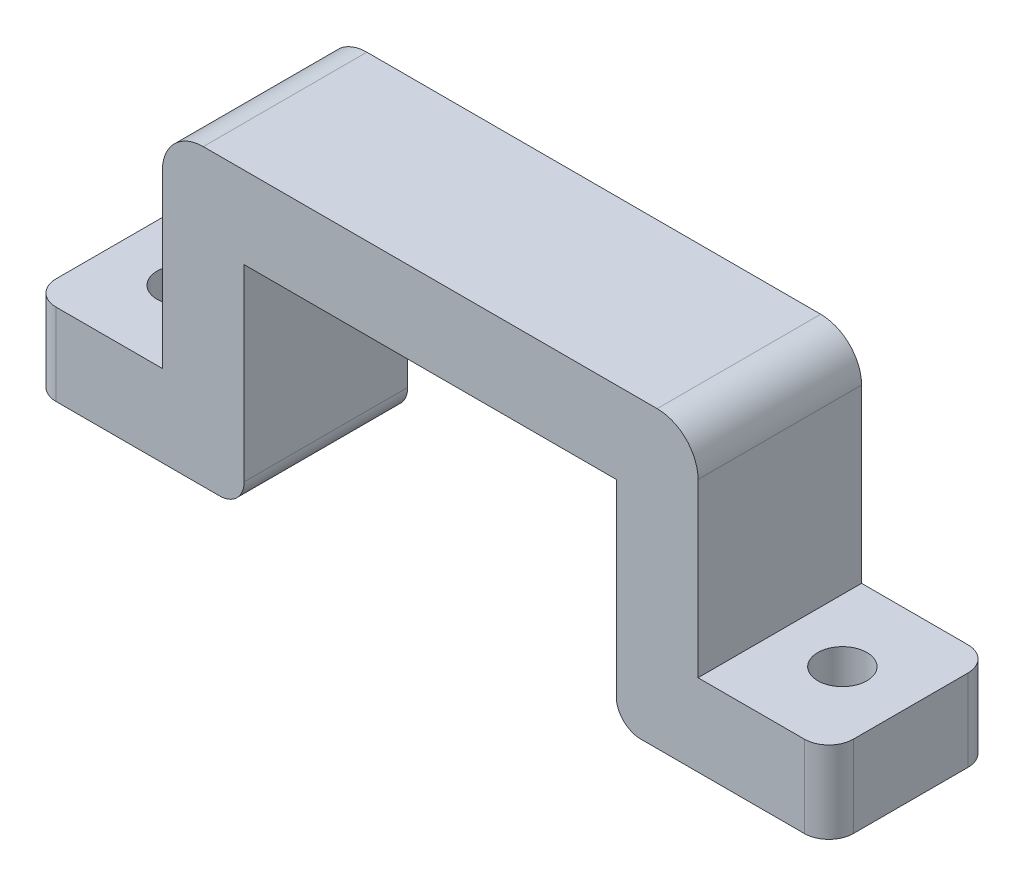
ISO-10303-21;
HEADER;
FILE_DESCRIPTION(('STEP AP214'),'2;1');
FILE_NAME('part.step','',(''),(''),'','','');
FILE_SCHEMA(('AUTOMOTIVE_DESIGN { 1 0 10303 214 1 1 1 1 }'));
ENDSEC;
DATA;
#1=APPLICATION_CONTEXT('core data for automotive mechanical design processes');
#2=APPLICATION_PROTOCOL_DEFINITION('international standard','automotive_design',2000,#1);
#3=PRODUCT_CONTEXT('',#1,'mechanical');
#4=PRODUCT('Part','Part','',(#3));
#5=PRODUCT_RELATED_PRODUCT_CATEGORY('part','',(#4));
#6=PRODUCT_DEFINITION_FORMATION('','',#4);
#7=PRODUCT_DEFINITION_CONTEXT('part definition',#1,'design');
#8=PRODUCT_DEFINITION('design','',#6,#7);
#9=PRODUCT_DEFINITION_SHAPE('','',#8);
#10=(LENGTH_UNIT() NAMED_UNIT(*) SI_UNIT(.MILLI.,.METRE.));
#11=(NAMED_UNIT(*) PLANE_ANGLE_UNIT() SI_UNIT($,.RADIAN.));
#12=(NAMED_UNIT(*) SI_UNIT($,.STERADIAN.) SOLID_ANGLE_UNIT());
#13=UNCERTAINTY_MEASURE_WITH_UNIT(LENGTH_MEASURE(1.E-05),#10,'distance_accuracy_value','');
#14=(GEOMETRIC_REPRESENTATION_CONTEXT(3) GLOBAL_UNCERTAINTY_ASSIGNED_CONTEXT((#13)) GLOBAL_UNIT_ASSIGNED_CONTEXT((#10,
#11,#12)) REPRESENTATION_CONTEXT('',''));
#15=CARTESIAN_POINT('',(0.,0.,0.));
#16=DIRECTION('',(0.,0.,1.));
#17=DIRECTION('',(1.,0.,0.));
#18=AXIS2_PLACEMENT_3D('',#15,#16,#17);
#19=CARTESIAN_POINT('',(16.375,0.,10.));
#20=DIRECTION('',(1.,0.,0.));
#21=DIRECTION('',(0.,0.,-1.));
#22=AXIS2_PLACEMENT_3D('',#19,#20,#21);
#23=PLANE('',#22);
#24=DIRECTION('',(0.,-1.,0.));
#25=VECTOR('',#24,1.);
#26=CARTESIAN_POINT('',(16.375,0.,10.));
#27=LINE('',#26,#25);
#28=CARTESIAN_POINT('',(16.375,9.,10.));
#29=VERTEX_POINT('',#28);
#30=CARTESIAN_POINT('',(16.375,-1.49999999999999,10.));
#31=VERTEX_POINT('',#30);
#32=EDGE_CURVE('E178',#29,#31,#27,.T.);
#33=ORIENTED_EDGE('',*,*,#32,.T.);
#34=DIRECTION('',(0.,0.,1.));
#35=VECTOR('',#34,1.);
#36=CARTESIAN_POINT('',(16.375,-1.49999999999999,0.));
#37=LINE('',#36,#35);
#38=CARTESIAN_POINT('',(16.375,-1.49999999999999,0.));
#39=VERTEX_POINT('',#38);
#40=EDGE_CURVE('E187',#39,#31,#37,.T.);
#41=ORIENTED_EDGE('',*,*,#40,.F.);
#42=DIRECTION('',(0.,-1.,0.));
#43=VECTOR('',#42,1.);
#44=CARTESIAN_POINT('',(16.375,0.,0.));
#45=LINE('',#44,#43);
#46=CARTESIAN_POINT('',(16.375,9.,0.));
#47=VERTEX_POINT('',#46);
#48=EDGE_CURVE('E230',#47,#39,#45,.T.);
#49=ORIENTED_EDGE('',*,*,#48,.F.);
#50=DIRECTION('',(0.,0.,-1.));
#51=VECTOR('',#50,1.);
#52=CARTESIAN_POINT('',(16.375,9.,10.));
#53=LINE('',#52,#51);
#54=EDGE_CURVE('E197',#29,#47,#53,.T.);
#55=ORIENTED_EDGE('',*,*,#54,.F.);
#56=EDGE_LOOP('',(#33,#41,#49,#55));
#57=FACE_BOUND('',#56,.T.);
#58=ADVANCED_FACE('F37',(#57),#23,.T.);
#59=CARTESIAN_POINT('',(-16.375,0.,10.));
#60=DIRECTION('',(1.,0.,0.));
#61=DIRECTION('',(0.,1.,0.));
#62=AXIS2_PLACEMENT_3D('',#59,#60,#61);
#63=PLANE('',#62);
#64=DIRECTION('',(0.,0.,-1.));
#65=VECTOR('',#64,1.);
#66=CARTESIAN_POINT('',(-16.375,-1.5,0.));
#67=LINE('',#66,#65);
#68=CARTESIAN_POINT('',(-16.375,-1.5,10.));
#69=VERTEX_POINT('',#68);
#70=CARTESIAN_POINT('',(-16.375,-1.5,0.));
#71=VERTEX_POINT('',#70);
#72=EDGE_CURVE('E183',#69,#71,#67,.T.);
#73=ORIENTED_EDGE('',*,*,#72,.F.);
#74=DIRECTION('',(0.,-1.,0.));
#75=VECTOR('',#74,1.);
#76=CARTESIAN_POINT('',(-16.375,0.,10.));
#77=LINE('',#76,#75);
#78=CARTESIAN_POINT('',(-16.375,9.,10.));
#79=VERTEX_POINT('',#78);
#80=EDGE_CURVE('E327',#79,#69,#77,.T.);
#81=ORIENTED_EDGE('',*,*,#80,.F.);
#82=DIRECTION('',(0.,0.,-1.));
#83=VECTOR('',#82,1.);
#84=CARTESIAN_POINT('',(-16.375,9.,10.));
#85=LINE('',#84,#83);
#86=CARTESIAN_POINT('',(-16.375,9.,0.));
#87=VERTEX_POINT('',#86);
#88=EDGE_CURVE('E248',#79,#87,#85,.T.);
#89=ORIENTED_EDGE('',*,*,#88,.T.);
#90=DIRECTION('',(0.,-1.,0.));
#91=VECTOR('',#90,1.);
#92=CARTESIAN_POINT('',(-16.375,0.,0.));
#93=LINE('',#92,#91);
#94=EDGE_CURVE('E214',#87,#71,#93,.T.);
#95=ORIENTED_EDGE('',*,*,#94,.T.);
#96=EDGE_LOOP('',(#73,#81,#89,#95));
#97=FACE_BOUND('',#96,.T.);
#98=ADVANCED_FACE('F396',(#97),#63,.F.);
#99=CARTESIAN_POINT('',(-13.875,9.,10.));
#100=DIRECTION('',(0.,0.,-1.));
#101=DIRECTION('',(-1.,0.,0.));
#102=AXIS2_PLACEMENT_3D('',#99,#100,#101);
#103=CYLINDRICAL_SURFACE('',#102,2.5);
#104=CARTESIAN_POINT('',(-13.875,9.,0.));
#105=DIRECTION('',(0.,0.,1.));
#106=DIRECTION('',(1.,0.,0.));
#107=AXIS2_PLACEMENT_3D('',#104,#105,#106);
#108=CIRCLE('',#107,2.5);
#109=CARTESIAN_POINT('',(-13.875,11.5,0.));
#110=VERTEX_POINT('',#109);
#111=EDGE_CURVE('E211',#87,#110,#108,.F.);
#112=ORIENTED_EDGE('',*,*,#111,.F.);
#113=ORIENTED_EDGE('',*,*,#88,.F.);
#114=CARTESIAN_POINT('',(-13.875,9.,10.));
#115=DIRECTION('',(0.,0.,1.));
#116=DIRECTION('',(1.,0.,0.));
#117=AXIS2_PLACEMENT_3D('',#114,#115,#116);
#118=CIRCLE('',#117,2.5);
#119=CARTESIAN_POINT('',(-13.875,11.5,10.));
#120=VERTEX_POINT('',#119);
#121=EDGE_CURVE('E238',#79,#120,#118,.F.);
#122=ORIENTED_EDGE('',*,*,#121,.T.);
#123=DIRECTION('',(0.,0.,-1.));
#124=VECTOR('',#123,1.);
#125=CARTESIAN_POINT('',(-13.875,11.5,10.));
#126=LINE('',#125,#124);
#127=EDGE_CURVE('E210',#120,#110,#126,.T.);
#128=ORIENTED_EDGE('',*,*,#127,.T.);
#129=EDGE_LOOP('',(#112,#113,#122,#128));
#130=FACE_BOUND('',#129,.T.);
#131=ADVANCED_FACE('F400',(#130),#103,.T.);
#132=CARTESIAN_POINT('',(0.,-6.5,10.));
#133=DIRECTION('',(0.,-1.,0.));
#134=DIRECTION('',(1.,0.,0.));
#135=AXIS2_PLACEMENT_3D('',#132,#133,#134);
#136=PLANE('',#135);
#137=CARTESIAN_POINT('',(-20.1985294117647,-6.50000000000001,5.));
#138=DIRECTION('',(0.,1.,0.));
#139=DIRECTION('',(-1.,0.,0.));
#140=AXIS2_PLACEMENT_3D('',#137,#138,#139);
#141=CIRCLE('',#140,1.5);
#142=CARTESIAN_POINT('',(-21.6985294117647,-6.50000000000001,5.));
#143=VERTEX_POINT('',#142);
#144=EDGE_CURVE('E195',#143,#143,#141,.T.);
#145=ORIENTED_EDGE('',*,*,#144,.T.);
#146=EDGE_LOOP('',(#145));
#147=FACE_BOUND('',#146,.T.);
#148=DIRECTION('',(-1.,0.,0.));
#149=VECTOR('',#148,1.);
#150=CARTESIAN_POINT('',(0.,-6.5,0.));
#151=LINE('',#150,#149);
#152=CARTESIAN_POINT('',(-12.875,-6.5,0.));
#153=VERTEX_POINT('',#152);
#154=CARTESIAN_POINT('',(-22.875,-6.5,0.));
#155=VERTEX_POINT('',#154);
#156=EDGE_CURVE('E218',#153,#155,#151,.T.);
#157=ORIENTED_EDGE('',*,*,#156,.F.);
#158=DIRECTION('',(0.,0.,-1.));
#159=VECTOR('',#158,1.);
#160=CARTESIAN_POINT('',(-12.875,-6.5,10.));
#161=LINE('',#160,#159);
#162=CARTESIAN_POINT('',(-12.875,-6.5,10.));
#163=VERTEX_POINT('',#162);
#164=EDGE_CURVE('E11',#153,#163,#161,.F.);
#165=ORIENTED_EDGE('',*,*,#164,.T.);
#166=DIRECTION('',(-1.,0.,0.));
#167=VECTOR('',#166,1.);
#168=CARTESIAN_POINT('',(0.,-6.5,10.));
#169=LINE('',#168,#167);
#170=CARTESIAN_POINT('',(-22.875,-6.5,10.));
#171=VERTEX_POINT('',#170);
#172=EDGE_CURVE('E325',#163,#171,#169,.T.);
#173=ORIENTED_EDGE('',*,*,#172,.T.);
#174=CARTESIAN_POINT('',(-22.875,-6.5,8.5));
#175=DIRECTION('',(0.,-1.,0.));
#176=DIRECTION('',(1.,0.,0.));
#177=AXIS2_PLACEMENT_3D('',#174,#175,#176);
#178=CIRCLE('',#177,1.5);
#179=CARTESIAN_POINT('',(-24.375,-6.5,8.5));
#180=VERTEX_POINT('',#179);
#181=EDGE_CURVE('E280',#171,#180,#178,.T.);
#182=ORIENTED_EDGE('',*,*,#181,.T.);
#183=DIRECTION('',(0.,0.,1.));
#184=VECTOR('',#183,1.);
#185=CARTESIAN_POINT('',(-24.375,-6.5,0.));
#186=LINE('',#185,#184);
#187=CARTESIAN_POINT('',(-24.375,-6.5,1.5));
#188=VERTEX_POINT('',#187);
#189=EDGE_CURVE('E338',#188,#180,#186,.T.);
#190=ORIENTED_EDGE('',*,*,#189,.F.);
#191=CARTESIAN_POINT('',(-22.875,-6.5,1.5));
#192=DIRECTION('',(0.,-1.,0.));
#193=DIRECTION('',(1.,0.,0.));
#194=AXIS2_PLACEMENT_3D('',#191,#192,#193);
#195=CIRCLE('',#194,1.5);
#196=EDGE_CURVE('E282',#188,#155,#195,.T.);
#197=ORIENTED_EDGE('',*,*,#196,.T.);
#198=EDGE_LOOP('',(#157,#165,#173,#182,#190,#197));
#199=FACE_BOUND('',#198,.T.);
#200=ADVANCED_FACE('F361',(#147,#199),#136,.T.);
#201=CARTESIAN_POINT('',(-11.375,0.,10.));
#202=DIRECTION('',(1.,0.,0.));
#203=DIRECTION('',(0.,1.,0.));
#204=AXIS2_PLACEMENT_3D('',#201,#202,#203);
#205=PLANE('',#204);
#206=DIRECTION('',(0.,-1.,0.));
#207=VECTOR('',#206,1.);
#208=CARTESIAN_POINT('',(-11.375,0.,10.));
#209=LINE('',#208,#207);
#210=CARTESIAN_POINT('',(-11.375,6.5,10.));
#211=VERTEX_POINT('',#210);
#212=CARTESIAN_POINT('',(-11.375,-5.,10.));
#213=VERTEX_POINT('',#212);
#214=EDGE_CURVE('E305',#211,#213,#209,.T.);
#215=ORIENTED_EDGE('',*,*,#214,.T.);
#216=DIRECTION('',(0.,0.,-1.));
#217=VECTOR('',#216,1.);
#218=CARTESIAN_POINT('',(-11.375,-5.,10.));
#219=LINE('',#218,#217);
#220=CARTESIAN_POINT('',(-11.375,-5.,0.));
#221=VERTEX_POINT('',#220);
#222=EDGE_CURVE('E45',#213,#221,#219,.T.);
#223=ORIENTED_EDGE('',*,*,#222,.T.);
#224=DIRECTION('',(0.,-1.,0.));
#225=VECTOR('',#224,1.);
#226=CARTESIAN_POINT('',(-11.375,0.,0.));
#227=LINE('',#226,#225);
#228=CARTESIAN_POINT('',(-11.375,6.5,0.));
#229=VERTEX_POINT('',#228);
#230=EDGE_CURVE('E220',#229,#221,#227,.T.);
#231=ORIENTED_EDGE('',*,*,#230,.F.);
#232=DIRECTION('',(0.,0.,-1.));
#233=VECTOR('',#232,1.);
#234=CARTESIAN_POINT('',(-11.375,6.5,10.));
#235=LINE('',#234,#233);
#236=EDGE_CURVE('E246',#211,#229,#235,.T.);
#237=ORIENTED_EDGE('',*,*,#236,.F.);
#238=EDGE_LOOP('',(#215,#223,#231,#237));
#239=FACE_BOUND('',#238,.T.);
#240=ADVANCED_FACE('F304',(#239),#205,.T.);
#241=CARTESIAN_POINT('',(0.,6.5,10.));
#242=DIRECTION('',(0.,1.,0.));
#243=DIRECTION('',(0.,0.,1.));
#244=AXIS2_PLACEMENT_3D('',#241,#242,#243);
#245=PLANE('',#244);
#246=DIRECTION('',(1.,0.,0.));
#247=VECTOR('',#246,1.);
#248=CARTESIAN_POINT('',(0.,6.5,0.));
#249=LINE('',#248,#247);
#250=CARTESIAN_POINT('',(11.375,6.5,0.));
#251=VERTEX_POINT('',#250);
#252=EDGE_CURVE('E223',#229,#251,#249,.T.);
#253=ORIENTED_EDGE('',*,*,#252,.T.);
#254=DIRECTION('',(0.,0.,-1.));
#255=VECTOR('',#254,1.);
#256=CARTESIAN_POINT('',(11.375,6.5,10.));
#257=LINE('',#256,#255);
#258=CARTESIAN_POINT('',(11.375,6.5,10.));
#259=VERTEX_POINT('',#258);
#260=EDGE_CURVE('E243',#259,#251,#257,.T.);
#261=ORIENTED_EDGE('',*,*,#260,.F.);
#262=DIRECTION('',(1.,0.,0.));
#263=VECTOR('',#262,1.);
#264=CARTESIAN_POINT('',(0.,6.5,10.));
#265=LINE('',#264,#263);
#266=EDGE_CURVE('E321',#211,#259,#265,.T.);
#267=ORIENTED_EDGE('',*,*,#266,.F.);
#268=ORIENTED_EDGE('',*,*,#236,.T.);
#269=EDGE_LOOP('',(#253,#261,#267,#268));
#270=FACE_BOUND('',#269,.T.);
#271=ADVANCED_FACE('F314',(#270),#245,.F.);
#272=CARTESIAN_POINT('',(11.375,0.,10.));
#273=DIRECTION('',(1.,0.,0.));
#274=DIRECTION('',(0.,1.,0.));
#275=AXIS2_PLACEMENT_3D('',#272,#273,#274);
#276=PLANE('',#275);
#277=DIRECTION('',(0.,-1.,0.));
#278=VECTOR('',#277,1.);
#279=CARTESIAN_POINT('',(11.375,0.,0.));
#280=LINE('',#279,#278);
#281=CARTESIAN_POINT('',(11.375,-5.,0.));
#282=VERTEX_POINT('',#281);
#283=EDGE_CURVE('E225',#251,#282,#280,.T.);
#284=ORIENTED_EDGE('',*,*,#283,.T.);
#285=DIRECTION('',(0.,0.,-1.));
#286=VECTOR('',#285,1.);
#287=CARTESIAN_POINT('',(11.375,-5.,10.));
#288=LINE('',#287,#286);
#289=CARTESIAN_POINT('',(11.375,-5.,10.));
#290=VERTEX_POINT('',#289);
#291=EDGE_CURVE('E296',#282,#290,#288,.F.);
#292=ORIENTED_EDGE('',*,*,#291,.T.);
#293=DIRECTION('',(0.,-1.,0.));
#294=VECTOR('',#293,1.);
#295=CARTESIAN_POINT('',(11.375,0.,10.));
#296=LINE('',#295,#294);
#297=EDGE_CURVE('E204',#259,#290,#296,.T.);
#298=ORIENTED_EDGE('',*,*,#297,.F.);
#299=ORIENTED_EDGE('',*,*,#260,.T.);
#300=EDGE_LOOP('',(#284,#292,#298,#299));
#301=FACE_BOUND('',#300,.T.);
#302=ADVANCED_FACE('F318',(#301),#276,.F.);
#303=CARTESIAN_POINT('',(0.,-6.5,10.));
#304=DIRECTION('',(0.,1.,0.));
#305=DIRECTION('',(0.,0.,1.));
#306=AXIS2_PLACEMENT_3D('',#303,#304,#305);
#307=PLANE('',#306);
#308=CARTESIAN_POINT('',(20.1985294117647,-6.5,5.));
#309=DIRECTION('',(0.,1.,0.));
#310=DIRECTION('',(1.,0.,0.));
#311=AXIS2_PLACEMENT_3D('',#308,#309,#310);
#312=CIRCLE('',#311,1.5);
#313=CARTESIAN_POINT('',(18.6985294117647,-6.5,5.));
#314=VERTEX_POINT('',#313);
#315=EDGE_CURVE('E352',#314,#314,#312,.T.);
#316=ORIENTED_EDGE('',*,*,#315,.T.);
#317=EDGE_LOOP('',(#316));
#318=FACE_BOUND('',#317,.T.);
#319=DIRECTION('',(1.,0.,0.));
#320=VECTOR('',#319,1.);
#321=CARTESIAN_POINT('',(0.,-6.5,10.));
#322=LINE('',#321,#320);
#323=CARTESIAN_POINT('',(12.875,-6.5,10.));
#324=VERTEX_POINT('',#323);
#325=CARTESIAN_POINT('',(22.875,-6.5,10.));
#326=VERTEX_POINT('',#325);
#327=EDGE_CURVE('E200',#324,#326,#322,.T.);
#328=ORIENTED_EDGE('',*,*,#327,.F.);
#329=DIRECTION('',(0.,0.,-1.));
#330=VECTOR('',#329,1.);
#331=CARTESIAN_POINT('',(12.875,-6.5,10.));
#332=LINE('',#331,#330);
#333=CARTESIAN_POINT('',(12.875,-6.5,0.));
#334=VERTEX_POINT('',#333);
#335=EDGE_CURVE('E289',#324,#334,#332,.T.);
#336=ORIENTED_EDGE('',*,*,#335,.T.);
#337=DIRECTION('',(1.,0.,0.));
#338=VECTOR('',#337,1.);
#339=CARTESIAN_POINT('',(0.,-6.5,0.));
#340=LINE('',#339,#338);
#341=CARTESIAN_POINT('',(22.875,-6.5,0.));
#342=VERTEX_POINT('',#341);
#343=EDGE_CURVE('E228',#334,#342,#340,.T.);
#344=ORIENTED_EDGE('',*,*,#343,.T.);
#345=CARTESIAN_POINT('',(22.875,-6.5,1.5));
#346=DIRECTION('',(0.,1.,0.));
#347=DIRECTION('',(0.,0.,1.));
#348=AXIS2_PLACEMENT_3D('',#345,#346,#347);
#349=CIRCLE('',#348,1.5);
#350=CARTESIAN_POINT('',(24.375,-6.49999999999998,1.5));
#351=VERTEX_POINT('',#350);
#352=EDGE_CURVE('E268',#342,#351,#349,.F.);
#353=ORIENTED_EDGE('',*,*,#352,.T.);
#354=DIRECTION('',(0.,0.,-1.));
#355=VECTOR('',#354,1.);
#356=CARTESIAN_POINT('',(24.375,-6.49999999999998,10.));
#357=LINE('',#356,#355);
#358=CARTESIAN_POINT('',(24.375,-6.49999999999998,8.5));
#359=VERTEX_POINT('',#358);
#360=EDGE_CURVE('E343',#359,#351,#357,.T.);
#361=ORIENTED_EDGE('',*,*,#360,.F.);
#362=CARTESIAN_POINT('',(22.875,-6.5,8.5));
#363=DIRECTION('',(0.,1.,0.));
#364=DIRECTION('',(0.,0.,1.));
#365=AXIS2_PLACEMENT_3D('',#362,#363,#364);
#366=CIRCLE('',#365,1.5);
#367=EDGE_CURVE('E265',#359,#326,#366,.F.);
#368=ORIENTED_EDGE('',*,*,#367,.T.);
#369=EDGE_LOOP('',(#328,#336,#344,#353,#361,#368));
#370=FACE_BOUND('',#369,.T.);
#371=ADVANCED_FACE('F408',(#318,#370),#307,.F.);
#372=CARTESIAN_POINT('',(13.875,9.,10.));
#373=DIRECTION('',(0.,0.,-1.));
#374=DIRECTION('',(-1.,0.,0.));
#375=AXIS2_PLACEMENT_3D('',#372,#373,#374);
#376=CYLINDRICAL_SURFACE('',#375,2.5);
#377=CARTESIAN_POINT('',(13.875,9.,0.));
#378=DIRECTION('',(0.,0.,1.));
#379=DIRECTION('',(1.,0.,0.));
#380=AXIS2_PLACEMENT_3D('',#377,#378,#379);
#381=CIRCLE('',#380,2.5);
#382=CARTESIAN_POINT('',(13.875,11.5,0.));
#383=VERTEX_POINT('',#382);
#384=EDGE_CURVE('E232',#47,#383,#381,.T.);
#385=ORIENTED_EDGE('',*,*,#384,.T.);
#386=DIRECTION('',(0.,0.,-1.));
#387=VECTOR('',#386,1.);
#388=CARTESIAN_POINT('',(13.875,11.5,10.));
#389=LINE('',#388,#387);
#390=CARTESIAN_POINT('',(13.875,11.5,10.));
#391=VERTEX_POINT('',#390);
#392=EDGE_CURVE('E240',#391,#383,#389,.T.);
#393=ORIENTED_EDGE('',*,*,#392,.F.);
#394=CARTESIAN_POINT('',(13.875,9.,10.));
#395=DIRECTION('',(0.,0.,1.));
#396=DIRECTION('',(1.,0.,0.));
#397=AXIS2_PLACEMENT_3D('',#394,#395,#396);
#398=CIRCLE('',#397,2.5);
#399=EDGE_CURVE('E199',#29,#391,#398,.T.);
#400=ORIENTED_EDGE('',*,*,#399,.F.);
#401=ORIENTED_EDGE('',*,*,#54,.T.);
#402=EDGE_LOOP('',(#385,#393,#400,#401));
#403=FACE_BOUND('',#402,.T.);
#404=ADVANCED_FACE('F406',(#403),#376,.T.);
#405=CARTESIAN_POINT('',(0.,11.5,10.));
#406=DIRECTION('',(0.,1.,0.));
#407=DIRECTION('',(-1.,0.,0.));
#408=AXIS2_PLACEMENT_3D('',#405,#406,#407);
#409=PLANE('',#408);
#410=DIRECTION('',(1.,0.,0.));
#411=VECTOR('',#410,1.);
#412=CARTESIAN_POINT('',(0.,11.5,0.));
#413=LINE('',#412,#411);
#414=EDGE_CURVE('E235',#110,#383,#413,.T.);
#415=ORIENTED_EDGE('',*,*,#414,.F.);
#416=ORIENTED_EDGE('',*,*,#127,.F.);
#417=DIRECTION('',(1.,0.,0.));
#418=VECTOR('',#417,1.);
#419=CARTESIAN_POINT('',(0.,11.5,10.));
#420=LINE('',#419,#418);
#421=EDGE_CURVE('E202',#120,#391,#420,.T.);
#422=ORIENTED_EDGE('',*,*,#421,.T.);
#423=ORIENTED_EDGE('',*,*,#392,.T.);
#424=EDGE_LOOP('',(#415,#416,#422,#423));
#425=FACE_BOUND('',#424,.T.);
#426=ADVANCED_FACE('F402',(#425),#409,.T.);
#427=CARTESIAN_POINT('',(0.,0.,10.));
#428=DIRECTION('',(0.,0.,1.));
#429=DIRECTION('',(1.,0.,0.));
#430=AXIS2_PLACEMENT_3D('',#427,#428,#429);
#431=PLANE('',#430);
#432=ORIENTED_EDGE('',*,*,#297,.T.);
#433=CARTESIAN_POINT('',(12.875,-5.,10.));
#434=DIRECTION('',(0.,0.,1.));
#435=DIRECTION('',(1.,0.,0.));
#436=AXIS2_PLACEMENT_3D('',#433,#434,#435);
#437=CIRCLE('',#436,1.5);
#438=EDGE_CURVE('E299',#290,#324,#437,.T.);
#439=ORIENTED_EDGE('',*,*,#438,.T.);
#440=ORIENTED_EDGE('',*,*,#327,.T.);
#441=DIRECTION('',(0.,-1.,0.));
#442=VECTOR('',#441,1.);
#443=CARTESIAN_POINT('',(22.875,0.,10.));
#444=LINE('',#443,#442);
#445=CARTESIAN_POINT('',(22.875,-1.49999999999998,10.));
#446=VERTEX_POINT('',#445);
#447=EDGE_CURVE('E180',#326,#446,#444,.F.);
#448=ORIENTED_EDGE('',*,*,#447,.T.);
#449=DIRECTION('',(-1.,0.,0.));
#450=VECTOR('',#449,1.);
#451=CARTESIAN_POINT('',(24.375,-1.49999999999998,10.));
#452=LINE('',#451,#450);
#453=EDGE_CURVE('E173',#446,#31,#452,.T.);
#454=ORIENTED_EDGE('',*,*,#453,.T.);
#455=ORIENTED_EDGE('',*,*,#32,.F.);
#456=ORIENTED_EDGE('',*,*,#399,.T.);
#457=ORIENTED_EDGE('',*,*,#421,.F.);
#458=ORIENTED_EDGE('',*,*,#121,.F.);
#459=ORIENTED_EDGE('',*,*,#80,.T.);
#460=DIRECTION('',(1.,0.,0.));
#461=VECTOR('',#460,1.);
#462=CARTESIAN_POINT('',(-24.375,-1.5,10.));
#463=LINE('',#462,#461);
#464=CARTESIAN_POINT('',(-22.875,-1.5,10.));
#465=VERTEX_POINT('',#464);
#466=EDGE_CURVE('E215',#465,#69,#463,.T.);
#467=ORIENTED_EDGE('',*,*,#466,.F.);
#468=DIRECTION('',(0.,1.,0.));
#469=VECTOR('',#468,1.);
#470=CARTESIAN_POINT('',(-22.875,-6.5,10.));
#471=LINE('',#470,#469);
#472=EDGE_CURVE('E270',#465,#171,#471,.F.);
#473=ORIENTED_EDGE('',*,*,#472,.T.);
#474=ORIENTED_EDGE('',*,*,#172,.F.);
#475=CARTESIAN_POINT('',(-12.875,-5.,10.));
#476=DIRECTION('',(0.,0.,1.));
#477=DIRECTION('',(1.,0.,0.));
#478=AXIS2_PLACEMENT_3D('',#475,#476,#477);
#479=CIRCLE('',#478,1.5);
#480=EDGE_CURVE('E52',#163,#213,#479,.T.);
#481=ORIENTED_EDGE('',*,*,#480,.T.);
#482=ORIENTED_EDGE('',*,*,#214,.F.);
#483=ORIENTED_EDGE('',*,*,#266,.T.);
#484=EDGE_LOOP('',(#432,#439,#440,#448,#454,#455,#456,#457,#458,#459,#467,#473,#474,#481,#482,#483));
#485=FACE_BOUND('',#484,.T.);
#486=ADVANCED_FACE('F176',(#485),#431,.T.);
#487=CARTESIAN_POINT('',(0.,0.,0.));
#488=DIRECTION('',(0.,0.,1.));
#489=DIRECTION('',(1.,0.,0.));
#490=AXIS2_PLACEMENT_3D('',#487,#488,#489);
#491=PLANE('',#490);
#492=ORIENTED_EDGE('',*,*,#343,.F.);
#493=CARTESIAN_POINT('',(12.875,-5.,0.));
#494=DIRECTION('',(0.,0.,1.));
#495=DIRECTION('',(1.,0.,0.));
#496=AXIS2_PLACEMENT_3D('',#493,#494,#495);
#497=CIRCLE('',#496,1.5);
#498=EDGE_CURVE('E294',#334,#282,#497,.F.);
#499=ORIENTED_EDGE('',*,*,#498,.T.);
#500=ORIENTED_EDGE('',*,*,#283,.F.);
#501=ORIENTED_EDGE('',*,*,#252,.F.);
#502=ORIENTED_EDGE('',*,*,#230,.T.);
#503=CARTESIAN_POINT('',(-12.875,-5.,0.));
#504=DIRECTION('',(0.,0.,1.));
#505=DIRECTION('',(1.,0.,0.));
#506=AXIS2_PLACEMENT_3D('',#503,#504,#505);
#507=CIRCLE('',#506,1.5);
#508=EDGE_CURVE('E292',#221,#153,#507,.F.);
#509=ORIENTED_EDGE('',*,*,#508,.T.);
#510=ORIENTED_EDGE('',*,*,#156,.T.);
#511=DIRECTION('',(0.,-1.,0.));
#512=VECTOR('',#511,1.);
#513=CARTESIAN_POINT('',(-22.875,0.,0.));
#514=LINE('',#513,#512);
#515=CARTESIAN_POINT('',(-22.875,-1.5,0.));
#516=VERTEX_POINT('',#515);
#517=EDGE_CURVE('E260',#155,#516,#514,.F.);
#518=ORIENTED_EDGE('',*,*,#517,.T.);
#519=DIRECTION('',(1.,0.,0.));
#520=VECTOR('',#519,1.);
#521=CARTESIAN_POINT('',(-24.375,-1.5,0.));
#522=LINE('',#521,#520);
#523=EDGE_CURVE('E333',#516,#71,#522,.T.);
#524=ORIENTED_EDGE('',*,*,#523,.T.);
#525=ORIENTED_EDGE('',*,*,#94,.F.);
#526=ORIENTED_EDGE('',*,*,#111,.T.);
#527=ORIENTED_EDGE('',*,*,#414,.T.);
#528=ORIENTED_EDGE('',*,*,#384,.F.);
#529=ORIENTED_EDGE('',*,*,#48,.T.);
#530=DIRECTION('',(-1.,0.,0.));
#531=VECTOR('',#530,1.);
#532=CARTESIAN_POINT('',(24.375,-1.49999999999998,0.));
#533=LINE('',#532,#531);
#534=CARTESIAN_POINT('',(22.875,-1.49999999999998,0.));
#535=VERTEX_POINT('',#534);
#536=EDGE_CURVE('E184',#535,#39,#533,.T.);
#537=ORIENTED_EDGE('',*,*,#536,.F.);
#538=DIRECTION('',(0.,1.,0.));
#539=VECTOR('',#538,1.);
#540=CARTESIAN_POINT('',(22.875,-6.49999999999999,0.));
#541=LINE('',#540,#539);
#542=EDGE_CURVE('E262',#535,#342,#541,.F.);
#543=ORIENTED_EDGE('',*,*,#542,.T.);
#544=EDGE_LOOP('',(#492,#499,#500,#501,#502,#509,#510,#518,#524,#525,#526,#527,#528,#529,#537,#543));
#545=FACE_BOUND('',#544,.T.);
#546=ADVANCED_FACE('F310',(#545),#491,.F.);
#547=CARTESIAN_POINT('',(-24.375,-1.5,0.));
#548=DIRECTION('',(0.,-1.,0.));
#549=DIRECTION('',(1.,0.,0.));
#550=AXIS2_PLACEMENT_3D('',#547,#548,#549);
#551=PLANE('',#550);
#552=CARTESIAN_POINT('',(-20.1985294117647,-1.5,5.));
#553=DIRECTION('',(0.,1.,0.));
#554=DIRECTION('',(-1.,0.,0.));
#555=AXIS2_PLACEMENT_3D('',#552,#553,#554);
#556=CIRCLE('',#555,1.5);
#557=CARTESIAN_POINT('',(-21.6985294117647,-1.5,5.));
#558=VERTEX_POINT('',#557);
#559=EDGE_CURVE('E355',#558,#558,#556,.T.);
#560=ORIENTED_EDGE('',*,*,#559,.F.);
#561=EDGE_LOOP('',(#560));
#562=FACE_BOUND('',#561,.T.);
#563=ORIENTED_EDGE('',*,*,#523,.F.);
#564=CARTESIAN_POINT('',(-22.875,-1.5,1.5));
#565=DIRECTION('',(0.,-1.,0.));
#566=DIRECTION('',(1.,0.,0.));
#567=AXIS2_PLACEMENT_3D('',#564,#565,#566);
#568=CIRCLE('',#567,1.5);
#569=CARTESIAN_POINT('',(-24.375,-1.5,1.5));
#570=VERTEX_POINT('',#569);
#571=EDGE_CURVE('E287',#516,#570,#568,.F.);
#572=ORIENTED_EDGE('',*,*,#571,.T.);
#573=DIRECTION('',(0.,0.,-1.));
#574=VECTOR('',#573,1.);
#575=CARTESIAN_POINT('',(-24.375,-1.5,0.));
#576=LINE('',#575,#574);
#577=CARTESIAN_POINT('',(-24.375,-1.5,8.5));
#578=VERTEX_POINT('',#577);
#579=EDGE_CURVE('E335',#578,#570,#576,.T.);
#580=ORIENTED_EDGE('',*,*,#579,.F.);
#581=CARTESIAN_POINT('',(-22.875,-1.5,8.5));
#582=DIRECTION('',(0.,-1.,0.));
#583=DIRECTION('',(1.,0.,0.));
#584=AXIS2_PLACEMENT_3D('',#581,#582,#583);
#585=CIRCLE('',#584,1.5);
#586=EDGE_CURVE('E285',#578,#465,#585,.F.);
#587=ORIENTED_EDGE('',*,*,#586,.T.);
#588=ORIENTED_EDGE('',*,*,#466,.T.);
#589=ORIENTED_EDGE('',*,*,#72,.T.);
#590=EDGE_LOOP('',(#563,#572,#580,#587,#588,#589));
#591=FACE_BOUND('',#590,.T.);
#592=ADVANCED_FACE('F370',(#562,#591),#551,.F.);
#593=CARTESIAN_POINT('',(-24.375,0.,0.));
#594=DIRECTION('',(1.,0.,0.));
#595=DIRECTION('',(0.,0.,-1.));
#596=AXIS2_PLACEMENT_3D('',#593,#594,#595);
#597=PLANE('',#596);
#598=ORIENTED_EDGE('',*,*,#579,.T.);
#599=DIRECTION('',(0.,-1.,0.));
#600=VECTOR('',#599,1.);
#601=CARTESIAN_POINT('',(-24.375,0.,1.5));
#602=LINE('',#601,#600);
#603=EDGE_CURVE('E277',#570,#188,#602,.T.);
#604=ORIENTED_EDGE('',*,*,#603,.T.);
#605=ORIENTED_EDGE('',*,*,#189,.T.);
#606=DIRECTION('',(0.,1.,0.));
#607=VECTOR('',#606,1.);
#608=CARTESIAN_POINT('',(-24.375,-1.5,8.5));
#609=LINE('',#608,#607);
#610=EDGE_CURVE('E274',#180,#578,#609,.T.);
#611=ORIENTED_EDGE('',*,*,#610,.T.);
#612=EDGE_LOOP('',(#598,#604,#605,#611));
#613=FACE_BOUND('',#612,.T.);
#614=ADVANCED_FACE('F373',(#613),#597,.F.);
#615=CARTESIAN_POINT('',(24.375,-1.49999999999998,0.));
#616=DIRECTION('',(0.,-1.,0.));
#617=DIRECTION('',(1.,0.,0.));
#618=AXIS2_PLACEMENT_3D('',#615,#616,#617);
#619=PLANE('',#618);
#620=CARTESIAN_POINT('',(20.1985294117647,-1.49999999999999,5.));
#621=DIRECTION('',(0.,1.,0.));
#622=DIRECTION('',(1.,0.,0.));
#623=AXIS2_PLACEMENT_3D('',#620,#621,#622);
#624=CIRCLE('',#623,1.5);
#625=CARTESIAN_POINT('',(18.6985294117647,-1.49999999999999,5.));
#626=VERTEX_POINT('',#625);
#627=EDGE_CURVE('E349',#626,#626,#624,.T.);
#628=ORIENTED_EDGE('',*,*,#627,.F.);
#629=EDGE_LOOP('',(#628));
#630=FACE_BOUND('',#629,.T.);
#631=DIRECTION('',(0.,0.,1.));
#632=VECTOR('',#631,1.);
#633=CARTESIAN_POINT('',(24.375,-1.49999999999998,0.));
#634=LINE('',#633,#632);
#635=CARTESIAN_POINT('',(24.375,-1.49999999999998,1.5));
#636=VERTEX_POINT('',#635);
#637=CARTESIAN_POINT('',(24.375,-1.49999999999998,8.5));
#638=VERTEX_POINT('',#637);
#639=EDGE_CURVE('E194',#636,#638,#634,.T.);
#640=ORIENTED_EDGE('',*,*,#639,.F.);
#641=CARTESIAN_POINT('',(22.875,-1.49999999999998,1.5));
#642=DIRECTION('',(0.,-1.,0.));
#643=DIRECTION('',(1.,0.,0.));
#644=AXIS2_PLACEMENT_3D('',#641,#642,#643);
#645=CIRCLE('',#644,1.5);
#646=EDGE_CURVE('E258',#636,#535,#645,.F.);
#647=ORIENTED_EDGE('',*,*,#646,.T.);
#648=ORIENTED_EDGE('',*,*,#536,.T.);
#649=ORIENTED_EDGE('',*,*,#40,.T.);
#650=ORIENTED_EDGE('',*,*,#453,.F.);
#651=CARTESIAN_POINT('',(22.875,-1.49999999999998,8.5));
#652=DIRECTION('',(0.,-1.,0.));
#653=DIRECTION('',(1.,0.,0.));
#654=AXIS2_PLACEMENT_3D('',#651,#652,#653);
#655=CIRCLE('',#654,1.5);
#656=EDGE_CURVE('E256',#446,#638,#655,.F.);
#657=ORIENTED_EDGE('',*,*,#656,.T.);
#658=EDGE_LOOP('',(#640,#647,#648,#649,#650,#657));
#659=FACE_BOUND('',#658,.T.);
#660=ADVANCED_FACE('F189',(#630,#659),#619,.F.);
#661=CARTESIAN_POINT('',(24.375,0.,0.));
#662=DIRECTION('',(1.,0.,0.));
#663=DIRECTION('',(0.,1.,0.));
#664=AXIS2_PLACEMENT_3D('',#661,#662,#663);
#665=PLANE('',#664);
#666=ORIENTED_EDGE('',*,*,#360,.T.);
#667=DIRECTION('',(0.,1.,0.));
#668=VECTOR('',#667,1.);
#669=CARTESIAN_POINT('',(24.375,-1.49999999999998,1.5));
#670=LINE('',#669,#668);
#671=EDGE_CURVE('E253',#351,#636,#670,.T.);
#672=ORIENTED_EDGE('',*,*,#671,.T.);
#673=ORIENTED_EDGE('',*,*,#639,.T.);
#674=DIRECTION('',(0.,-1.,0.));
#675=VECTOR('',#674,1.);
#676=CARTESIAN_POINT('',(24.375,0.,8.5));
#677=LINE('',#676,#675);
#678=EDGE_CURVE('E250',#638,#359,#677,.T.);
#679=ORIENTED_EDGE('',*,*,#678,.T.);
#680=EDGE_LOOP('',(#666,#672,#673,#679));
#681=FACE_BOUND('',#680,.T.);
#682=ADVANCED_FACE('F438',(#681),#665,.T.);
#683=CARTESIAN_POINT('',(22.875,0.,1.5));
#684=DIRECTION('',(0.,-1.,0.));
#685=DIRECTION('',(1.,0.,0.));
#686=AXIS2_PLACEMENT_3D('',#683,#684,#685);
#687=CYLINDRICAL_SURFACE('',#686,1.5);
#688=ORIENTED_EDGE('',*,*,#352,.F.);
#689=ORIENTED_EDGE('',*,*,#542,.F.);
#690=ORIENTED_EDGE('',*,*,#646,.F.);
#691=ORIENTED_EDGE('',*,*,#671,.F.);
#692=EDGE_LOOP('',(#688,#689,#690,#691));
#693=FACE_BOUND('',#692,.T.);
#694=ADVANCED_FACE('F434',(#693),#687,.T.);
#695=CARTESIAN_POINT('',(22.875,0.,8.5));
#696=DIRECTION('',(0.,-1.,0.));
#697=DIRECTION('',(1.,0.,0.));
#698=AXIS2_PLACEMENT_3D('',#695,#696,#697);
#699=CYLINDRICAL_SURFACE('',#698,1.5);
#700=ORIENTED_EDGE('',*,*,#656,.F.);
#701=ORIENTED_EDGE('',*,*,#447,.F.);
#702=ORIENTED_EDGE('',*,*,#367,.F.);
#703=ORIENTED_EDGE('',*,*,#678,.F.);
#704=EDGE_LOOP('',(#700,#701,#702,#703));
#705=FACE_BOUND('',#704,.T.);
#706=ADVANCED_FACE('F437',(#705),#699,.T.);
#707=CARTESIAN_POINT('',(-22.875,0.,1.5));
#708=DIRECTION('',(0.,-1.,0.));
#709=DIRECTION('',(0.,0.,-1.));
#710=AXIS2_PLACEMENT_3D('',#707,#708,#709);
#711=CYLINDRICAL_SURFACE('',#710,1.5);
#712=ORIENTED_EDGE('',*,*,#571,.F.);
#713=ORIENTED_EDGE('',*,*,#517,.F.);
#714=ORIENTED_EDGE('',*,*,#196,.F.);
#715=ORIENTED_EDGE('',*,*,#603,.F.);
#716=EDGE_LOOP('',(#712,#713,#714,#715));
#717=FACE_BOUND('',#716,.T.);
#718=ADVANCED_FACE('F383',(#717),#711,.T.);
#719=CARTESIAN_POINT('',(-22.875,0.,8.5));
#720=DIRECTION('',(0.,-1.,0.));
#721=DIRECTION('',(0.,0.,-1.));
#722=AXIS2_PLACEMENT_3D('',#719,#720,#721);
#723=CYLINDRICAL_SURFACE('',#722,1.5);
#724=ORIENTED_EDGE('',*,*,#181,.F.);
#725=ORIENTED_EDGE('',*,*,#472,.F.);
#726=ORIENTED_EDGE('',*,*,#586,.F.);
#727=ORIENTED_EDGE('',*,*,#610,.F.);
#728=EDGE_LOOP('',(#724,#725,#726,#727));
#729=FACE_BOUND('',#728,.T.);
#730=ADVANCED_FACE('F390',(#729),#723,.T.);
#731=CARTESIAN_POINT('',(12.875,-5.,10.));
#732=DIRECTION('',(0.,0.,-1.));
#733=DIRECTION('',(-1.,0.,0.));
#734=AXIS2_PLACEMENT_3D('',#731,#732,#733);
#735=CYLINDRICAL_SURFACE('',#734,1.5);
#736=ORIENTED_EDGE('',*,*,#438,.F.);
#737=ORIENTED_EDGE('',*,*,#291,.F.);
#738=ORIENTED_EDGE('',*,*,#498,.F.);
#739=ORIENTED_EDGE('',*,*,#335,.F.);
#740=EDGE_LOOP('',(#736,#737,#738,#739));
#741=FACE_BOUND('',#740,.T.);
#742=ADVANCED_FACE('F446',(#741),#735,.T.);
#743=CARTESIAN_POINT('',(-12.875,-5.,10.));
#744=DIRECTION('',(0.,0.,-1.));
#745=DIRECTION('',(-1.,0.,0.));
#746=AXIS2_PLACEMENT_3D('',#743,#744,#745);
#747=CYLINDRICAL_SURFACE('',#746,1.5);
#748=ORIENTED_EDGE('',*,*,#480,.F.);
#749=ORIENTED_EDGE('',*,*,#164,.F.);
#750=ORIENTED_EDGE('',*,*,#508,.F.);
#751=ORIENTED_EDGE('',*,*,#222,.F.);
#752=EDGE_LOOP('',(#748,#749,#750,#751));
#753=FACE_BOUND('',#752,.T.);
#754=ADVANCED_FACE('F39',(#753),#747,.T.);
#755=CARTESIAN_POINT('',(20.1985294117647,-6.5,5.));
#756=DIRECTION('',(0.,1.,0.));
#757=DIRECTION('',(-1.,0.,0.));
#758=AXIS2_PLACEMENT_3D('',#755,#756,#757);
#759=CYLINDRICAL_SURFACE('',#758,1.5);
#760=CARTESIAN_POINT('',(18.6985294117647,-6.5,5.));
#761=CARTESIAN_POINT('',(18.6985294117647,-6.44791666666667,5.));
#762=CARTESIAN_POINT('',(18.6985294117647,-6.39583333333334,5.));
#763=CARTESIAN_POINT('',(18.6985294117647,-6.29166666666667,5.));
#764=CARTESIAN_POINT('',(18.6985294117647,-6.23958333333334,5.));
#765=CARTESIAN_POINT('',(18.6985294117647,-6.13541666666667,5.));
#766=CARTESIAN_POINT('',(18.6985294117647,-6.08333333333334,5.));
#767=CARTESIAN_POINT('',(18.6985294117647,-5.97916666666667,5.));
#768=CARTESIAN_POINT('',(18.6985294117647,-5.92708333333334,5.));
#769=CARTESIAN_POINT('',(18.6985294117647,-5.82291666666667,5.));
#770=CARTESIAN_POINT('',(18.6985294117647,-5.77083333333333,5.));
#771=CARTESIAN_POINT('',(18.6985294117647,-5.66666666666667,5.));
#772=CARTESIAN_POINT('',(18.6985294117647,-5.61458333333333,5.));
#773=CARTESIAN_POINT('',(18.6985294117647,-5.51041666666667,5.));
#774=CARTESIAN_POINT('',(18.6985294117647,-5.45833333333333,5.));
#775=CARTESIAN_POINT('',(18.6985294117647,-5.35416666666667,5.));
#776=CARTESIAN_POINT('',(18.6985294117647,-5.30208333333333,5.));
#777=CARTESIAN_POINT('',(18.6985294117647,-5.19791666666667,5.));
#778=CARTESIAN_POINT('',(18.6985294117647,-5.14583333333333,5.));
#779=CARTESIAN_POINT('',(18.6985294117647,-5.04166666666667,5.));
#780=CARTESIAN_POINT('',(18.6985294117647,-4.98958333333333,5.));
#781=CARTESIAN_POINT('',(18.6985294117647,-4.88541666666667,5.));
#782=CARTESIAN_POINT('',(18.6985294117647,-4.83333333333333,5.));
#783=CARTESIAN_POINT('',(18.6985294117647,-4.72916666666667,5.));
#784=CARTESIAN_POINT('',(18.6985294117647,-4.67708333333333,5.));
#785=CARTESIAN_POINT('',(18.6985294117647,-4.57291666666667,5.));
#786=CARTESIAN_POINT('',(18.6985294117647,-4.52083333333333,5.));
#787=CARTESIAN_POINT('',(18.6985294117647,-4.41666666666667,5.));
#788=CARTESIAN_POINT('',(18.6985294117647,-4.36458333333333,5.));
#789=CARTESIAN_POINT('',(18.6985294117647,-4.26041666666666,5.));
#790=CARTESIAN_POINT('',(18.6985294117647,-4.20833333333333,5.));
#791=CARTESIAN_POINT('',(18.6985294117647,-4.10416666666666,5.));
#792=CARTESIAN_POINT('',(18.6985294117647,-4.05208333333333,5.));
#793=CARTESIAN_POINT('',(18.6985294117647,-3.94791666666666,5.));
#794=CARTESIAN_POINT('',(18.6985294117647,-3.89583333333333,5.));
#795=CARTESIAN_POINT('',(18.6985294117647,-3.79166666666666,5.));
#796=CARTESIAN_POINT('',(18.6985294117647,-3.73958333333333,5.));
#797=CARTESIAN_POINT('',(18.6985294117647,-3.63541666666666,5.));
#798=CARTESIAN_POINT('',(18.6985294117647,-3.58333333333333,5.));
#799=CARTESIAN_POINT('',(18.6985294117647,-3.47916666666666,5.));
#800=CARTESIAN_POINT('',(18.6985294117647,-3.42708333333333,5.));
#801=CARTESIAN_POINT('',(18.6985294117647,-3.32291666666666,5.));
#802=CARTESIAN_POINT('',(18.6985294117647,-3.27083333333333,5.));
#803=CARTESIAN_POINT('',(18.6985294117647,-3.16666666666666,5.));
#804=CARTESIAN_POINT('',(18.6985294117647,-3.11458333333333,5.));
#805=CARTESIAN_POINT('',(18.6985294117647,-3.01041666666666,5.));
#806=CARTESIAN_POINT('',(18.6985294117647,-2.95833333333333,5.));
#807=CARTESIAN_POINT('',(18.6985294117647,-2.85416666666666,5.));
#808=CARTESIAN_POINT('',(18.6985294117647,-2.80208333333333,5.));
#809=CARTESIAN_POINT('',(18.6985294117647,-2.69791666666666,5.));
#810=CARTESIAN_POINT('',(18.6985294117647,-2.64583333333333,5.));
#811=CARTESIAN_POINT('',(18.6985294117647,-2.54166666666666,5.));
#812=CARTESIAN_POINT('',(18.6985294117647,-2.48958333333333,5.));
#813=CARTESIAN_POINT('',(18.6985294117647,-2.38541666666666,5.));
#814=CARTESIAN_POINT('',(18.6985294117647,-2.33333333333333,5.));
#815=CARTESIAN_POINT('',(18.6985294117647,-2.22916666666666,5.));
#816=CARTESIAN_POINT('',(18.6985294117647,-2.17708333333333,5.));
#817=CARTESIAN_POINT('',(18.6985294117647,-2.07291666666666,5.));
#818=CARTESIAN_POINT('',(18.6985294117647,-2.02083333333333,5.));
#819=CARTESIAN_POINT('',(18.6985294117647,-1.91666666666666,5.));
#820=CARTESIAN_POINT('',(18.6985294117647,-1.86458333333333,5.));
#821=CARTESIAN_POINT('',(18.6985294117647,-1.76041666666666,5.));
#822=CARTESIAN_POINT('',(18.6985294117647,-1.70833333333333,5.));
#823=CARTESIAN_POINT('',(18.6985294117647,-1.60416666666666,5.));
#824=CARTESIAN_POINT('',(18.6985294117647,-1.55208333333333,5.));
#825=CARTESIAN_POINT('',(18.6985294117647,-1.49999999999999,5.));
#826=B_SPLINE_CURVE_WITH_KNOTS('',3,(#760,#761,#762,#763,#764,#765,#766,#767,#768,#769,#770,
#771,#772,#773,#774,#775,#776,#777,#778,#779,#780,#781,#782,#783,#784,#785,#786,#787,#788,#789,
#790,#791,#792,#793,#794,#795,#796,#797,#798,#799,#800,#801,#802,#803,#804,#805,#806,#807,#808,
#809,#810,#811,#812,#813,#814,#815,#816,#817,#818,#819,#820,#821,#822,#823,#824,#825),
.UNSPECIFIED.,.F.,.F.,(4,2,2,2,2,2,2,2,2,2,2,2,2,2,2,2,2,2,2,2,2,2,2,2,2,2,2,2,2,2,2,2,4),(0.,
0.156250000000001,0.312500000000001,0.468750000000001,0.625000000000001,0.781250000000002,
0.937500000000003,1.09375,1.25,1.40625,1.5625,1.71875,1.87500000000001,2.03125,2.18750000000001,
2.34375000000001,2.50000000000001,2.65625000000001,2.81250000000001,2.96875000000001,
3.12500000000001,3.28125000000001,3.43750000000001,3.59375000000001,3.75000000000001,
3.90625000000001,4.06250000000001,4.21875000000001,4.37500000000001,4.53125000000001,
4.68750000000001,4.84375000000001,5.00000000000001),.UNSPECIFIED.);
#827=EDGE_CURVE('BSEAM366',#314,#626,#826,.T.);
#828=ORIENTED_EDGE('',*,*,#315,.F.);
#829=ORIENTED_EDGE('',*,*,#627,.T.);
#830=ORIENTED_EDGE('',*,*,#827,.T.);
#831=ORIENTED_EDGE('',*,*,#827,.F.);
#832=EDGE_LOOP('',(#828,#830,#829,#831));
#833=FACE_BOUND('',#832,.T.);
#834=ADVANCED_FACE('F366',(#833),#759,.F.);
#835=CARTESIAN_POINT('',(-20.1985294117647,-6.50000000000001,5.));
#836=DIRECTION('',(0.,1.,0.));
#837=DIRECTION('',(-1.,0.,0.));
#838=AXIS2_PLACEMENT_3D('',#835,#836,#837);
#839=CYLINDRICAL_SURFACE('',#838,1.5);
#840=CARTESIAN_POINT('',(-21.6985294117647,-6.50000000000001,5.));
#841=CARTESIAN_POINT('',(-21.6985294117647,-6.44791666666668,5.));
#842=CARTESIAN_POINT('',(-21.6985294117647,-6.39583333333334,5.));
#843=CARTESIAN_POINT('',(-21.6985294117647,-6.29166666666668,5.));
#844=CARTESIAN_POINT('',(-21.6985294117647,-6.23958333333334,5.));
#845=CARTESIAN_POINT('',(-21.6985294117647,-6.13541666666667,5.));
#846=CARTESIAN_POINT('',(-21.6985294117647,-6.08333333333334,5.));
#847=CARTESIAN_POINT('',(-21.6985294117647,-5.97916666666667,5.));
#848=CARTESIAN_POINT('',(-21.6985294117647,-5.92708333333334,5.));
#849=CARTESIAN_POINT('',(-21.6985294117647,-5.82291666666667,5.));
#850=CARTESIAN_POINT('',(-21.6985294117647,-5.77083333333334,5.));
#851=CARTESIAN_POINT('',(-21.6985294117647,-5.66666666666667,5.));
#852=CARTESIAN_POINT('',(-21.6985294117647,-5.61458333333334,5.));
#853=CARTESIAN_POINT('',(-21.6985294117647,-5.51041666666667,5.));
#854=CARTESIAN_POINT('',(-21.6985294117647,-5.45833333333334,5.));
#855=CARTESIAN_POINT('',(-21.6985294117647,-5.35416666666667,5.));
#856=CARTESIAN_POINT('',(-21.6985294117647,-5.30208333333334,5.));
#857=CARTESIAN_POINT('',(-21.6985294117647,-5.19791666666667,5.));
#858=CARTESIAN_POINT('',(-21.6985294117647,-5.14583333333334,5.));
#859=CARTESIAN_POINT('',(-21.6985294117647,-5.04166666666667,5.));
#860=CARTESIAN_POINT('',(-21.6985294117647,-4.98958333333334,5.));
#861=CARTESIAN_POINT('',(-21.6985294117647,-4.88541666666667,5.));
#862=CARTESIAN_POINT('',(-21.6985294117647,-4.83333333333334,5.));
#863=CARTESIAN_POINT('',(-21.6985294117647,-4.72916666666667,5.));
#864=CARTESIAN_POINT('',(-21.6985294117647,-4.67708333333334,5.));
#865=CARTESIAN_POINT('',(-21.6985294117647,-4.57291666666667,5.));
#866=CARTESIAN_POINT('',(-21.6985294117647,-4.52083333333334,5.));
#867=CARTESIAN_POINT('',(-21.6985294117647,-4.41666666666667,5.));
#868=CARTESIAN_POINT('',(-21.6985294117647,-4.36458333333334,5.));
#869=CARTESIAN_POINT('',(-21.6985294117647,-4.26041666666667,5.));
#870=CARTESIAN_POINT('',(-21.6985294117647,-4.20833333333334,5.));
#871=CARTESIAN_POINT('',(-21.6985294117647,-4.10416666666667,5.));
#872=CARTESIAN_POINT('',(-21.6985294117647,-4.05208333333334,5.));
#873=CARTESIAN_POINT('',(-21.6985294117647,-3.94791666666667,5.));
#874=CARTESIAN_POINT('',(-21.6985294117647,-3.89583333333334,5.));
#875=CARTESIAN_POINT('',(-21.6985294117647,-3.79166666666667,5.));
#876=CARTESIAN_POINT('',(-21.6985294117647,-3.73958333333334,5.));
#877=CARTESIAN_POINT('',(-21.6985294117647,-3.63541666666667,5.));
#878=CARTESIAN_POINT('',(-21.6985294117647,-3.58333333333334,5.));
#879=CARTESIAN_POINT('',(-21.6985294117647,-3.47916666666667,5.));
#880=CARTESIAN_POINT('',(-21.6985294117647,-3.42708333333334,5.));
#881=CARTESIAN_POINT('',(-21.6985294117647,-3.32291666666667,5.));
#882=CARTESIAN_POINT('',(-21.6985294117647,-3.27083333333334,5.));
#883=CARTESIAN_POINT('',(-21.6985294117647,-3.16666666666667,5.));
#884=CARTESIAN_POINT('',(-21.6985294117647,-3.11458333333334,5.));
#885=CARTESIAN_POINT('',(-21.6985294117647,-3.01041666666667,5.));
#886=CARTESIAN_POINT('',(-21.6985294117647,-2.95833333333333,5.));
#887=CARTESIAN_POINT('',(-21.6985294117647,-2.85416666666667,5.));
#888=CARTESIAN_POINT('',(-21.6985294117647,-2.80208333333333,5.));
#889=CARTESIAN_POINT('',(-21.6985294117647,-2.69791666666667,5.));
#890=CARTESIAN_POINT('',(-21.6985294117647,-2.64583333333333,5.));
#891=CARTESIAN_POINT('',(-21.6985294117647,-2.54166666666667,5.));
#892=CARTESIAN_POINT('',(-21.6985294117647,-2.48958333333333,5.));
#893=CARTESIAN_POINT('',(-21.6985294117647,-2.38541666666667,5.));
#894=CARTESIAN_POINT('',(-21.6985294117647,-2.33333333333333,5.));
#895=CARTESIAN_POINT('',(-21.6985294117647,-2.22916666666667,5.));
#896=CARTESIAN_POINT('',(-21.6985294117647,-2.17708333333333,5.));
#897=CARTESIAN_POINT('',(-21.6985294117647,-2.07291666666667,5.));
#898=CARTESIAN_POINT('',(-21.6985294117647,-2.02083333333333,5.));
#899=CARTESIAN_POINT('',(-21.6985294117647,-1.91666666666667,5.));
#900=CARTESIAN_POINT('',(-21.6985294117647,-1.86458333333333,5.));
#901=CARTESIAN_POINT('',(-21.6985294117647,-1.76041666666667,5.));
#902=CARTESIAN_POINT('',(-21.6985294117647,-1.70833333333333,5.));
#903=CARTESIAN_POINT('',(-21.6985294117647,-1.60416666666667,5.));
#904=CARTESIAN_POINT('',(-21.6985294117647,-1.55208333333333,5.));
#905=CARTESIAN_POINT('',(-21.6985294117647,-1.5,5.));
#906=B_SPLINE_CURVE_WITH_KNOTS('',3,(#840,#841,#842,#843,#844,#845,#846,#847,#848,#849,#850,
#851,#852,#853,#854,#855,#856,#857,#858,#859,#860,#861,#862,#863,#864,#865,#866,#867,#868,#869,
#870,#871,#872,#873,#874,#875,#876,#877,#878,#879,#880,#881,#882,#883,#884,#885,#886,#887,#888,
#889,#890,#891,#892,#893,#894,#895,#896,#897,#898,#899,#900,#901,#902,#903,#904,#905),
.UNSPECIFIED.,.F.,.F.,(4,2,2,2,2,2,2,2,2,2,2,2,2,2,2,2,2,2,2,2,2,2,2,2,2,2,2,2,2,2,2,2,4),(0.,
0.156250000000001,0.312500000000001,0.468750000000001,0.625000000000001,0.781250000000002,
0.937500000000003,1.09375,1.25,1.40625,1.5625,1.71875,1.87500000000001,2.03125,2.18750000000001,
2.34375000000001,2.50000000000001,2.65625000000001,2.81250000000001,2.96875000000001,
3.12500000000001,3.28125000000001,3.43750000000001,3.59375000000001,3.75000000000001,
3.90625000000001,4.06250000000001,4.21875000000001,4.37500000000001,4.53125000000001,
4.68750000000001,4.84375000000001,5.00000000000001),.UNSPECIFIED.);
#907=EDGE_CURVE('BSEAM363',#143,#558,#906,.T.);
#908=ORIENTED_EDGE('',*,*,#144,.F.);
#909=ORIENTED_EDGE('',*,*,#559,.T.);
#910=ORIENTED_EDGE('',*,*,#907,.T.);
#911=ORIENTED_EDGE('',*,*,#907,.F.);
#912=EDGE_LOOP('',(#908,#910,#909,#911));
#913=FACE_BOUND('',#912,.T.);
#914=ADVANCED_FACE('F363',(#913),#839,.F.);
#915=CLOSED_SHELL('',(#58,#98,#131,#200,#240,#271,#302,#371,#404,#426,#486,#546,#592,#614,#660,
#682,#694,#706,#718,#730,#742,#754,#834,#914));
#916=MANIFOLD_SOLID_BREP('B2',#915);
#917=ADVANCED_BREP_SHAPE_REPRESENTATION('',(#18,#916),#14);
#918=SHAPE_DEFINITION_REPRESENTATION(#9,#917);
ENDSEC;
END-ISO-10303-21;
